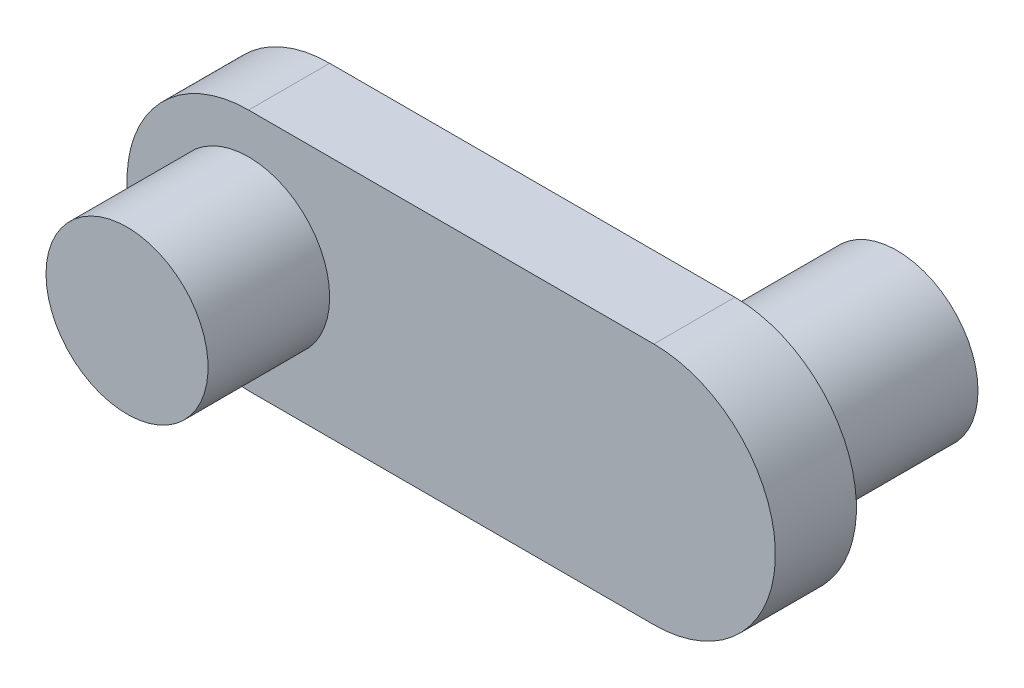
ISO-10303-21;
HEADER;
FILE_DESCRIPTION(('STEP AP214'),'2;1');
FILE_NAME('part.step','',(''),(''),'','','');
FILE_SCHEMA(('AUTOMOTIVE_DESIGN { 1 0 10303 214 1 1 1 1 }'));
ENDSEC;
DATA;
#1=APPLICATION_CONTEXT('core data for automotive mechanical design processes');
#2=APPLICATION_PROTOCOL_DEFINITION('international standard','automotive_design',2000,#1);
#3=PRODUCT_CONTEXT('',#1,'mechanical');
#4=PRODUCT('Part','Part','',(#3));
#5=PRODUCT_RELATED_PRODUCT_CATEGORY('part','',(#4));
#6=PRODUCT_DEFINITION_FORMATION('','',#4);
#7=PRODUCT_DEFINITION_CONTEXT('part definition',#1,'design');
#8=PRODUCT_DEFINITION('design','',#6,#7);
#9=PRODUCT_DEFINITION_SHAPE('','',#8);
#10=(LENGTH_UNIT() NAMED_UNIT(*) SI_UNIT(.MILLI.,.METRE.));
#11=(NAMED_UNIT(*) PLANE_ANGLE_UNIT() SI_UNIT($,.RADIAN.));
#12=(NAMED_UNIT(*) SI_UNIT($,.STERADIAN.) SOLID_ANGLE_UNIT());
#13=UNCERTAINTY_MEASURE_WITH_UNIT(LENGTH_MEASURE(1.E-05),#10,'distance_accuracy_value','');
#14=(GEOMETRIC_REPRESENTATION_CONTEXT(3) GLOBAL_UNCERTAINTY_ASSIGNED_CONTEXT((#13)) GLOBAL_UNIT_ASSIGNED_CONTEXT((#10,
#11,#12)) REPRESENTATION_CONTEXT('',''));
#15=CARTESIAN_POINT('',(0.,0.,0.));
#16=DIRECTION('',(0.,0.,1.));
#17=DIRECTION('',(1.,0.,0.));
#18=AXIS2_PLACEMENT_3D('',#15,#16,#17);
#19=CARTESIAN_POINT('',(-95.0110787199231,0.,10.));
#20=DIRECTION('',(0.,0.,1.));
#21=DIRECTION('',(1.,0.,0.));
#22=AXIS2_PLACEMENT_3D('',#19,#20,#21);
#23=PLANE('',#22);
#24=CARTESIAN_POINT('',(-95.0110787199231,0.,10.));
#25=DIRECTION('',(0.,0.,1.));
#26=DIRECTION('',(1.,0.,0.));
#27=AXIS2_PLACEMENT_3D('',#24,#25,#26);
#28=CIRCLE('',#27,9.99999999999999);
#29=CARTESIAN_POINT('',(-85.0110787199231,0.,10.));
#30=VERTEX_POINT('',#29);
#31=EDGE_CURVE('E98',#30,#30,#28,.T.);
#32=ORIENTED_EDGE('',*,*,#31,.F.);
#33=EDGE_LOOP('',(#32));
#34=FACE_BOUND('',#33,.T.);
#35=CARTESIAN_POINT('',(-95.0110787199231,0.,10.));
#36=DIRECTION('',(0.,0.,1.));
#37=DIRECTION('',(1.,0.,0.));
#38=AXIS2_PLACEMENT_3D('',#35,#36,#37);
#39=CIRCLE('',#38,15.);
#40=CARTESIAN_POINT('',(-95.0110787199231,15.,10.));
#41=VERTEX_POINT('',#40);
#42=CARTESIAN_POINT('',(-95.0110787199231,-15.,10.));
#43=VERTEX_POINT('',#42);
#44=EDGE_CURVE('E83',#41,#43,#39,.T.);
#45=ORIENTED_EDGE('',*,*,#44,.T.);
#46=DIRECTION('',(1.,0.,0.));
#47=VECTOR('',#46,1.);
#48=CARTESIAN_POINT('',(-95.0110787199231,-15.,10.));
#49=LINE('',#48,#47);
#50=CARTESIAN_POINT('',(-45.0110787199231,-15.,10.));
#51=VERTEX_POINT('',#50);
#52=EDGE_CURVE('E79',#43,#51,#49,.T.);
#53=ORIENTED_EDGE('',*,*,#52,.T.);
#54=CARTESIAN_POINT('',(-45.0110787199231,0.,10.));
#55=DIRECTION('',(0.,0.,1.));
#56=DIRECTION('',(1.,0.,0.));
#57=AXIS2_PLACEMENT_3D('',#54,#55,#56);
#58=CIRCLE('',#57,15.);
#59=CARTESIAN_POINT('',(-45.0110787199231,15.,10.));
#60=VERTEX_POINT('',#59);
#61=EDGE_CURVE('E81',#51,#60,#58,.T.);
#62=ORIENTED_EDGE('',*,*,#61,.T.);
#63=DIRECTION('',(-1.,0.,0.));
#64=VECTOR('',#63,1.);
#65=CARTESIAN_POINT('',(-95.0110787199231,15.,10.));
#66=LINE('',#65,#64);
#67=EDGE_CURVE('E49',#60,#41,#66,.T.);
#68=ORIENTED_EDGE('',*,*,#67,.T.);
#69=EDGE_LOOP('',(#45,#53,#62,#68));
#70=FACE_BOUND('',#69,.T.);
#71=ADVANCED_FACE('F32',(#34,#70),#23,.T.);
#72=CARTESIAN_POINT('',(-95.0110787199231,0.,0.));
#73=DIRECTION('',(0.,0.,1.));
#74=DIRECTION('',(1.,0.,0.));
#75=AXIS2_PLACEMENT_3D('',#72,#73,#74);
#76=PLANE('',#75);
#77=CARTESIAN_POINT('',(-95.0110787199231,0.,0.));
#78=DIRECTION('',(0.,0.,1.));
#79=DIRECTION('',(1.,0.,0.));
#80=AXIS2_PLACEMENT_3D('',#77,#78,#79);
#81=CIRCLE('',#80,15.);
#82=CARTESIAN_POINT('',(-95.0110787199231,15.,0.));
#83=VERTEX_POINT('',#82);
#84=CARTESIAN_POINT('',(-95.0110787199231,-15.,0.));
#85=VERTEX_POINT('',#84);
#86=EDGE_CURVE('E95',#83,#85,#81,.T.);
#87=ORIENTED_EDGE('',*,*,#86,.F.);
#88=DIRECTION('',(-1.,0.,0.));
#89=VECTOR('',#88,1.);
#90=CARTESIAN_POINT('',(-95.0110787199231,15.,0.));
#91=LINE('',#90,#89);
#92=CARTESIAN_POINT('',(-45.0110787199231,15.,0.));
#93=VERTEX_POINT('',#92);
#94=EDGE_CURVE('E72',#93,#83,#91,.T.);
#95=ORIENTED_EDGE('',*,*,#94,.F.);
#96=CARTESIAN_POINT('',(-45.0110787199231,0.,0.));
#97=DIRECTION('',(0.,0.,1.));
#98=DIRECTION('',(1.,0.,0.));
#99=AXIS2_PLACEMENT_3D('',#96,#97,#98);
#100=CIRCLE('',#99,15.);
#101=CARTESIAN_POINT('',(-45.0110787199231,-15.,0.));
#102=VERTEX_POINT('',#101);
#103=EDGE_CURVE('E66',#102,#93,#100,.T.);
#104=ORIENTED_EDGE('',*,*,#103,.F.);
#105=DIRECTION('',(1.,0.,0.));
#106=VECTOR('',#105,1.);
#107=CARTESIAN_POINT('',(-95.0110787199231,-15.,0.));
#108=LINE('',#107,#106);
#109=EDGE_CURVE('E87',#85,#102,#108,.T.);
#110=ORIENTED_EDGE('',*,*,#109,.F.);
#111=EDGE_LOOP('',(#87,#95,#104,#110));
#112=FACE_BOUND('',#111,.T.);
#113=CARTESIAN_POINT('',(-45.0110787199231,0.,0.));
#114=DIRECTION('',(0.,0.,1.));
#115=DIRECTION('',(1.,0.,0.));
#116=AXIS2_PLACEMENT_3D('',#113,#114,#115);
#117=CIRCLE('',#116,10.);
#118=CARTESIAN_POINT('',(-35.0110787199231,0.,0.));
#119=VERTEX_POINT('',#118);
#120=EDGE_CURVE('E112',#119,#119,#117,.T.);
#121=ORIENTED_EDGE('',*,*,#120,.T.);
#122=EDGE_LOOP('',(#121));
#123=FACE_BOUND('',#122,.T.);
#124=ADVANCED_FACE('F106',(#112,#123),#76,.F.);
#125=CARTESIAN_POINT('',(-95.0110787199231,0.,10.));
#126=DIRECTION('',(0.,0.,-1.));
#127=DIRECTION('',(-1.,0.,0.));
#128=AXIS2_PLACEMENT_3D('',#125,#126,#127);
#129=CYLINDRICAL_SURFACE('',#128,15.);
#130=ORIENTED_EDGE('',*,*,#86,.T.);
#131=DIRECTION('',(0.,0.,-1.));
#132=VECTOR('',#131,1.);
#133=CARTESIAN_POINT('',(-95.0110787199231,-15.,10.));
#134=LINE('',#133,#132);
#135=EDGE_CURVE('E11',#43,#85,#134,.T.);
#136=ORIENTED_EDGE('',*,*,#135,.F.);
#137=ORIENTED_EDGE('',*,*,#44,.F.);
#138=DIRECTION('',(0.,0.,-1.));
#139=VECTOR('',#138,1.);
#140=CARTESIAN_POINT('',(-95.0110787199231,15.,10.));
#141=LINE('',#140,#139);
#142=EDGE_CURVE('E91',#41,#83,#141,.T.);
#143=ORIENTED_EDGE('',*,*,#142,.T.);
#144=EDGE_LOOP('',(#130,#136,#137,#143));
#145=FACE_BOUND('',#144,.T.);
#146=ADVANCED_FACE('F34',(#145),#129,.T.);
#147=CARTESIAN_POINT('',(-95.0110787199231,-15.,10.));
#148=DIRECTION('',(0.,1.,0.));
#149=DIRECTION('',(0.,0.,1.));
#150=AXIS2_PLACEMENT_3D('',#147,#148,#149);
#151=PLANE('',#150);
#152=ORIENTED_EDGE('',*,*,#109,.T.);
#153=DIRECTION('',(0.,0.,-1.));
#154=VECTOR('',#153,1.);
#155=CARTESIAN_POINT('',(-45.0110787199231,-15.,10.));
#156=LINE('',#155,#154);
#157=EDGE_CURVE('E41',#51,#102,#156,.T.);
#158=ORIENTED_EDGE('',*,*,#157,.F.);
#159=ORIENTED_EDGE('',*,*,#52,.F.);
#160=ORIENTED_EDGE('',*,*,#135,.T.);
#161=EDGE_LOOP('',(#152,#158,#159,#160));
#162=FACE_BOUND('',#161,.T.);
#163=ADVANCED_FACE('F86',(#162),#151,.F.);
#164=CARTESIAN_POINT('',(-45.0110787199231,0.,10.));
#165=DIRECTION('',(0.,0.,-1.));
#166=DIRECTION('',(-1.,0.,0.));
#167=AXIS2_PLACEMENT_3D('',#164,#165,#166);
#168=CYLINDRICAL_SURFACE('',#167,15.);
#169=ORIENTED_EDGE('',*,*,#103,.T.);
#170=DIRECTION('',(0.,0.,-1.));
#171=VECTOR('',#170,1.);
#172=CARTESIAN_POINT('',(-45.0110787199231,15.,10.));
#173=LINE('',#172,#171);
#174=EDGE_CURVE('E88',#60,#93,#173,.T.);
#175=ORIENTED_EDGE('',*,*,#174,.F.);
#176=ORIENTED_EDGE('',*,*,#61,.F.);
#177=ORIENTED_EDGE('',*,*,#157,.T.);
#178=EDGE_LOOP('',(#169,#175,#176,#177));
#179=FACE_BOUND('',#178,.T.);
#180=ADVANCED_FACE('F89',(#179),#168,.T.);
#181=CARTESIAN_POINT('',(-95.0110787199231,15.,10.));
#182=DIRECTION('',(0.,-1.,0.));
#183=DIRECTION('',(0.,0.,-1.));
#184=AXIS2_PLACEMENT_3D('',#181,#182,#183);
#185=PLANE('',#184);
#186=ORIENTED_EDGE('',*,*,#94,.T.);
#187=ORIENTED_EDGE('',*,*,#142,.F.);
#188=ORIENTED_EDGE('',*,*,#67,.F.);
#189=ORIENTED_EDGE('',*,*,#174,.T.);
#190=EDGE_LOOP('',(#186,#187,#188,#189));
#191=FACE_BOUND('',#190,.T.);
#192=ADVANCED_FACE('F103',(#191),#185,.F.);
#193=CARTESIAN_POINT('',(-45.0110787199231,0.,-20.));
#194=DIRECTION('',(0.,0.,1.));
#195=DIRECTION('',(1.,0.,0.));
#196=AXIS2_PLACEMENT_3D('',#193,#194,#195);
#197=CYLINDRICAL_SURFACE('',#196,10.);
#198=CARTESIAN_POINT('',(-45.0110787199231,0.,-20.));
#199=DIRECTION('',(0.,0.,1.));
#200=DIRECTION('',(1.,0.,0.));
#201=AXIS2_PLACEMENT_3D('',#198,#199,#200);
#202=CIRCLE('',#201,10.);
#203=CARTESIAN_POINT('',(-35.0110787199231,0.,-20.));
#204=VERTEX_POINT('',#203);
#205=EDGE_CURVE('E115',#204,#204,#202,.T.);
#206=ORIENTED_EDGE('',*,*,#205,.T.);
#207=EDGE_LOOP('',(#206));
#208=FACE_BOUND('',#207,.T.);
#209=ORIENTED_EDGE('',*,*,#120,.F.);
#210=EDGE_LOOP('',(#209));
#211=FACE_BOUND('',#210,.T.);
#212=ADVANCED_FACE('F142',(#208,#211),#197,.T.);
#213=CARTESIAN_POINT('',(-45.0110787199231,0.,-20.));
#214=DIRECTION('',(0.,0.,1.));
#215=DIRECTION('',(1.,0.,0.));
#216=AXIS2_PLACEMENT_3D('',#213,#214,#215);
#217=PLANE('',#216);
#218=ORIENTED_EDGE('',*,*,#205,.F.);
#219=EDGE_LOOP('',(#218));
#220=FACE_BOUND('',#219,.T.);
#221=ADVANCED_FACE('F130',(#220),#217,.F.);
#222=CARTESIAN_POINT('',(-95.0110787199231,0.,25.));
#223=DIRECTION('',(0.,0.,-1.));
#224=DIRECTION('',(-1.,0.,0.));
#225=AXIS2_PLACEMENT_3D('',#222,#223,#224);
#226=CYLINDRICAL_SURFACE('',#225,9.99999999999999);
#227=ORIENTED_EDGE('',*,*,#31,.T.);
#228=EDGE_LOOP('',(#227));
#229=FACE_BOUND('',#228,.T.);
#230=CARTESIAN_POINT('',(-95.0110787199231,0.,25.));
#231=DIRECTION('',(0.,0.,-1.));
#232=DIRECTION('',(-1.,0.,0.));
#233=AXIS2_PLACEMENT_3D('',#230,#231,#232);
#234=CIRCLE('',#233,9.99999999999999);
#235=CARTESIAN_POINT('',(-105.011078719923,0.,25.));
#236=VERTEX_POINT('',#235);
#237=EDGE_CURVE('E118',#236,#236,#234,.T.);
#238=ORIENTED_EDGE('',*,*,#237,.T.);
#239=EDGE_LOOP('',(#238));
#240=FACE_BOUND('',#239,.T.);
#241=ADVANCED_FACE('F122',(#229,#240),#226,.T.);
#242=CARTESIAN_POINT('',(-95.0110787199231,0.,25.));
#243=DIRECTION('',(0.,0.,-1.));
#244=DIRECTION('',(-1.,0.,0.));
#245=AXIS2_PLACEMENT_3D('',#242,#243,#244);
#246=PLANE('',#245);
#247=ORIENTED_EDGE('',*,*,#237,.F.);
#248=EDGE_LOOP('',(#247));
#249=FACE_BOUND('',#248,.T.);
#250=ADVANCED_FACE('F124',(#249),#246,.F.);
#251=CLOSED_SHELL('',(#71,#124,#146,#163,#180,#192,#212,#221,#241,#250));
#252=MANIFOLD_SOLID_BREP('B2',#251);
#253=ADVANCED_BREP_SHAPE_REPRESENTATION('',(#18,#252),#14);
#254=SHAPE_DEFINITION_REPRESENTATION(#9,#253);
ENDSEC;
END-ISO-10303-21;
